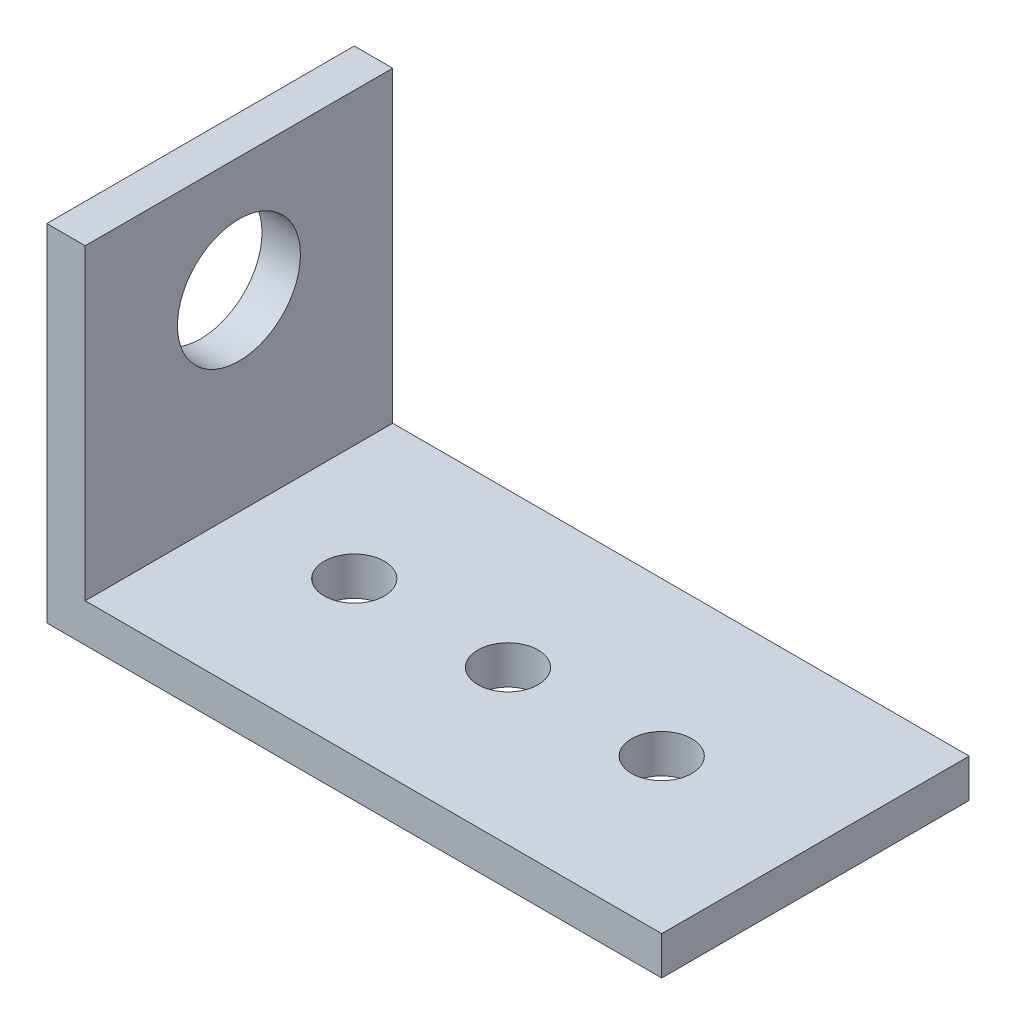
ISO-10303-21;
HEADER;
FILE_DESCRIPTION(('STEP AP214'),'2;1');
FILE_NAME('part.step','',(''),(''),'','','');
FILE_SCHEMA(('AUTOMOTIVE_DESIGN { 1 0 10303 214 1 1 1 1 }'));
ENDSEC;
DATA;
#1=APPLICATION_CONTEXT('core data for automotive mechanical design processes');
#2=APPLICATION_PROTOCOL_DEFINITION('international standard','automotive_design',2000,#1);
#3=PRODUCT_CONTEXT('',#1,'mechanical');
#4=PRODUCT('Part','Part','',(#3));
#5=PRODUCT_RELATED_PRODUCT_CATEGORY('part','',(#4));
#6=PRODUCT_DEFINITION_FORMATION('','',#4);
#7=PRODUCT_DEFINITION_CONTEXT('part definition',#1,'design');
#8=PRODUCT_DEFINITION('design','',#6,#7);
#9=PRODUCT_DEFINITION_SHAPE('','',#8);
#10=(LENGTH_UNIT() NAMED_UNIT(*) SI_UNIT(.MILLI.,.METRE.));
#11=(NAMED_UNIT(*) PLANE_ANGLE_UNIT() SI_UNIT($,.RADIAN.));
#12=(NAMED_UNIT(*) SI_UNIT($,.STERADIAN.) SOLID_ANGLE_UNIT());
#13=UNCERTAINTY_MEASURE_WITH_UNIT(LENGTH_MEASURE(1.E-05),#10,'distance_accuracy_value','');
#14=(GEOMETRIC_REPRESENTATION_CONTEXT(3) GLOBAL_UNCERTAINTY_ASSIGNED_CONTEXT((#13)) GLOBAL_UNIT_ASSIGNED_CONTEXT((#10,
#11,#12)) REPRESENTATION_CONTEXT('',''));
#15=CARTESIAN_POINT('',(0.,0.,0.));
#16=DIRECTION('',(0.,0.,1.));
#17=DIRECTION('',(1.,0.,0.));
#18=AXIS2_PLACEMENT_3D('',#15,#16,#17);
#19=CARTESIAN_POINT('',(0.,0.,25.4));
#20=DIRECTION('',(-1.,0.,0.));
#21=DIRECTION('',(0.,0.,1.));
#22=AXIS2_PLACEMENT_3D('',#19,#20,#21);
#23=PLANE('',#22);
#24=CARTESIAN_POINT('',(0.,19.05,12.7));
#25=DIRECTION('',(-1.,0.,0.));
#26=DIRECTION('',(0.,0.,1.));
#27=AXIS2_PLACEMENT_3D('',#24,#25,#26);
#28=CIRCLE('',#27,5.08);
#29=CARTESIAN_POINT('',(0.,19.05,17.78));
#30=VERTEX_POINT('',#29);
#31=EDGE_CURVE('E212',#30,#30,#28,.T.);
#32=ORIENTED_EDGE('',*,*,#31,.F.);
#33=EDGE_LOOP('',(#32));
#34=FACE_BOUND('',#33,.T.);
#35=DIRECTION('',(0.,1.,0.));
#36=VECTOR('',#35,1.);
#37=CARTESIAN_POINT('',(0.,0.,0.));
#38=LINE('',#37,#36);
#39=CARTESIAN_POINT('',(0.,0.,0.));
#40=VERTEX_POINT('',#39);
#41=CARTESIAN_POINT('',(0.,28.575,0.));
#42=VERTEX_POINT('',#41);
#43=EDGE_CURVE('E152',#40,#42,#38,.T.);
#44=ORIENTED_EDGE('',*,*,#43,.F.);
#45=DIRECTION('',(0.,0.,-1.));
#46=VECTOR('',#45,1.);
#47=CARTESIAN_POINT('',(0.,0.,25.4));
#48=LINE('',#47,#46);
#49=CARTESIAN_POINT('',(0.,0.,25.4));
#50=VERTEX_POINT('',#49);
#51=EDGE_CURVE('E13',#50,#40,#48,.T.);
#52=ORIENTED_EDGE('',*,*,#51,.F.);
#53=DIRECTION('',(0.,1.,0.));
#54=VECTOR('',#53,1.);
#55=CARTESIAN_POINT('',(0.,0.,25.4));
#56=LINE('',#55,#54);
#57=CARTESIAN_POINT('',(0.,28.575,25.4));
#58=VERTEX_POINT('',#57);
#59=EDGE_CURVE('E172',#50,#58,#56,.T.);
#60=ORIENTED_EDGE('',*,*,#59,.T.);
#61=DIRECTION('',(0.,0.,-1.));
#62=VECTOR('',#61,1.);
#63=CARTESIAN_POINT('',(0.,28.575,25.4));
#64=LINE('',#63,#62);
#65=EDGE_CURVE('E78',#58,#42,#64,.T.);
#66=ORIENTED_EDGE('',*,*,#65,.T.);
#67=EDGE_LOOP('',(#44,#52,#60,#66));
#68=FACE_BOUND('',#67,.T.);
#69=ADVANCED_FACE('F61',(#34,#68),#23,.T.);
#70=CARTESIAN_POINT('',(0.,0.,25.4));
#71=DIRECTION('',(0.,1.,0.));
#72=DIRECTION('',(0.,0.,1.));
#73=AXIS2_PLACEMENT_3D('',#70,#71,#72);
#74=PLANE('',#73);
#75=CARTESIAN_POINT('',(38.1,0.,12.7));
#76=DIRECTION('',(0.,1.,0.));
#77=DIRECTION('',(0.,0.,1.));
#78=AXIS2_PLACEMENT_3D('',#75,#76,#77);
#79=CIRCLE('',#78,2.4892);
#80=CARTESIAN_POINT('',(38.1,0.,15.1892));
#81=VERTEX_POINT('',#80);
#82=EDGE_CURVE('E156',#81,#81,#79,.T.);
#83=ORIENTED_EDGE('',*,*,#82,.T.);
#84=EDGE_LOOP('',(#83));
#85=FACE_BOUND('',#84,.T.);
#86=CARTESIAN_POINT('',(25.4,0.,12.7));
#87=DIRECTION('',(0.,1.,0.));
#88=DIRECTION('',(0.,0.,1.));
#89=AXIS2_PLACEMENT_3D('',#86,#87,#88);
#90=CIRCLE('',#89,2.4892);
#91=CARTESIAN_POINT('',(25.4,0.,15.1892));
#92=VERTEX_POINT('',#91);
#93=EDGE_CURVE('E239',#92,#92,#90,.T.);
#94=ORIENTED_EDGE('',*,*,#93,.T.);
#95=EDGE_LOOP('',(#94));
#96=FACE_BOUND('',#95,.T.);
#97=CARTESIAN_POINT('',(12.7,0.,12.7));
#98=DIRECTION('',(0.,1.,0.));
#99=DIRECTION('',(0.,0.,1.));
#100=AXIS2_PLACEMENT_3D('',#97,#98,#99);
#101=CIRCLE('',#100,2.4892);
#102=CARTESIAN_POINT('',(12.7,0.,15.1892));
#103=VERTEX_POINT('',#102);
#104=EDGE_CURVE('E232',#103,#103,#101,.T.);
#105=ORIENTED_EDGE('',*,*,#104,.T.);
#106=EDGE_LOOP('',(#105));
#107=FACE_BOUND('',#106,.T.);
#108=DIRECTION('',(1.,0.,0.));
#109=VECTOR('',#108,1.);
#110=CARTESIAN_POINT('',(0.,0.,0.));
#111=LINE('',#110,#109);
#112=CARTESIAN_POINT('',(50.8,0.,0.));
#113=VERTEX_POINT('',#112);
#114=EDGE_CURVE('E155',#40,#113,#111,.T.);
#115=ORIENTED_EDGE('',*,*,#114,.T.);
#116=DIRECTION('',(0.,0.,-1.));
#117=VECTOR('',#116,1.);
#118=CARTESIAN_POINT('',(50.8,0.,25.4));
#119=LINE('',#118,#117);
#120=CARTESIAN_POINT('',(50.8,0.,25.4));
#121=VERTEX_POINT('',#120);
#122=EDGE_CURVE('E70',#121,#113,#119,.T.);
#123=ORIENTED_EDGE('',*,*,#122,.F.);
#124=DIRECTION('',(1.,0.,0.));
#125=VECTOR('',#124,1.);
#126=CARTESIAN_POINT('',(0.,0.,25.4));
#127=LINE('',#126,#125);
#128=EDGE_CURVE('E146',#50,#121,#127,.T.);
#129=ORIENTED_EDGE('',*,*,#128,.F.);
#130=ORIENTED_EDGE('',*,*,#51,.T.);
#131=EDGE_LOOP('',(#115,#123,#129,#130));
#132=FACE_BOUND('',#131,.T.);
#133=ADVANCED_FACE('F203',(#85,#96,#107,#132),#74,.F.);
#134=CARTESIAN_POINT('',(50.8,0.,25.4));
#135=DIRECTION('',(-1.,0.,0.));
#136=DIRECTION('',(0.,0.,1.));
#137=AXIS2_PLACEMENT_3D('',#134,#135,#136);
#138=PLANE('',#137);
#139=DIRECTION('',(0.,1.,0.));
#140=VECTOR('',#139,1.);
#141=CARTESIAN_POINT('',(50.8,0.,0.));
#142=LINE('',#141,#140);
#143=CARTESIAN_POINT('',(50.8,3.175,0.));
#144=VERTEX_POINT('',#143);
#145=EDGE_CURVE('E159',#113,#144,#142,.T.);
#146=ORIENTED_EDGE('',*,*,#145,.T.);
#147=DIRECTION('',(0.,0.,-1.));
#148=VECTOR('',#147,1.);
#149=CARTESIAN_POINT('',(50.8,3.175,25.4));
#150=LINE('',#149,#148);
#151=CARTESIAN_POINT('',(50.8,3.175,25.4));
#152=VERTEX_POINT('',#151);
#153=EDGE_CURVE('E127',#152,#144,#150,.T.);
#154=ORIENTED_EDGE('',*,*,#153,.F.);
#155=DIRECTION('',(0.,1.,0.));
#156=VECTOR('',#155,1.);
#157=CARTESIAN_POINT('',(50.8,0.,25.4));
#158=LINE('',#157,#156);
#159=EDGE_CURVE('E139',#121,#152,#158,.T.);
#160=ORIENTED_EDGE('',*,*,#159,.F.);
#161=ORIENTED_EDGE('',*,*,#122,.T.);
#162=EDGE_LOOP('',(#146,#154,#160,#161));
#163=FACE_BOUND('',#162,.T.);
#164=ADVANCED_FACE('F185',(#163),#138,.F.);
#165=CARTESIAN_POINT('',(0.,3.175,25.4));
#166=DIRECTION('',(0.,1.,0.));
#167=DIRECTION('',(0.,0.,1.));
#168=AXIS2_PLACEMENT_3D('',#165,#166,#167);
#169=PLANE('',#168);
#170=CARTESIAN_POINT('',(38.1,3.175,12.7));
#171=DIRECTION('',(0.,1.,0.));
#172=DIRECTION('',(0.,0.,1.));
#173=AXIS2_PLACEMENT_3D('',#170,#171,#172);
#174=CIRCLE('',#173,2.4892);
#175=CARTESIAN_POINT('',(38.1,3.175,15.1892));
#176=VERTEX_POINT('',#175);
#177=EDGE_CURVE('E228',#176,#176,#174,.T.);
#178=ORIENTED_EDGE('',*,*,#177,.F.);
#179=EDGE_LOOP('',(#178));
#180=FACE_BOUND('',#179,.T.);
#181=CARTESIAN_POINT('',(25.4,3.175,12.7));
#182=DIRECTION('',(0.,1.,0.));
#183=DIRECTION('',(0.,0.,1.));
#184=AXIS2_PLACEMENT_3D('',#181,#182,#183);
#185=CIRCLE('',#184,2.4892);
#186=CARTESIAN_POINT('',(25.4,3.175,15.1892));
#187=VERTEX_POINT('',#186);
#188=EDGE_CURVE('E223',#187,#187,#185,.T.);
#189=ORIENTED_EDGE('',*,*,#188,.F.);
#190=EDGE_LOOP('',(#189));
#191=FACE_BOUND('',#190,.T.);
#192=CARTESIAN_POINT('',(12.7,3.175,12.7));
#193=DIRECTION('',(0.,1.,0.));
#194=DIRECTION('',(0.,0.,1.));
#195=AXIS2_PLACEMENT_3D('',#192,#193,#194);
#196=CIRCLE('',#195,2.4892);
#197=CARTESIAN_POINT('',(12.7,3.175,15.1892));
#198=VERTEX_POINT('',#197);
#199=EDGE_CURVE('E215',#198,#198,#196,.T.);
#200=ORIENTED_EDGE('',*,*,#199,.F.);
#201=EDGE_LOOP('',(#200));
#202=FACE_BOUND('',#201,.T.);
#203=DIRECTION('',(1.,0.,0.));
#204=VECTOR('',#203,1.);
#205=CARTESIAN_POINT('',(0.,3.175,0.));
#206=LINE('',#205,#204);
#207=CARTESIAN_POINT('',(3.175,3.175,0.));
#208=VERTEX_POINT('',#207);
#209=EDGE_CURVE('E123',#208,#144,#206,.T.);
#210=ORIENTED_EDGE('',*,*,#209,.F.);
#211=DIRECTION('',(0.,0.,-1.));
#212=VECTOR('',#211,1.);
#213=CARTESIAN_POINT('',(3.175,3.175,25.4));
#214=LINE('',#213,#212);
#215=CARTESIAN_POINT('',(3.175,3.175,25.4));
#216=VERTEX_POINT('',#215);
#217=EDGE_CURVE('E117',#216,#208,#214,.T.);
#218=ORIENTED_EDGE('',*,*,#217,.F.);
#219=DIRECTION('',(1.,0.,0.));
#220=VECTOR('',#219,1.);
#221=CARTESIAN_POINT('',(0.,3.175,25.4));
#222=LINE('',#221,#220);
#223=EDGE_CURVE('E121',#216,#152,#222,.T.);
#224=ORIENTED_EDGE('',*,*,#223,.T.);
#225=ORIENTED_EDGE('',*,*,#153,.T.);
#226=EDGE_LOOP('',(#210,#218,#224,#225));
#227=FACE_BOUND('',#226,.T.);
#228=ADVANCED_FACE('F119',(#180,#191,#202,#227),#169,.T.);
#229=CARTESIAN_POINT('',(3.175,0.,25.4));
#230=DIRECTION('',(-1.,0.,0.));
#231=DIRECTION('',(0.,0.,1.));
#232=AXIS2_PLACEMENT_3D('',#229,#230,#231);
#233=PLANE('',#232);
#234=CARTESIAN_POINT('',(3.175,19.05,12.7));
#235=DIRECTION('',(1.,0.,0.));
#236=DIRECTION('',(0.,0.,-1.));
#237=AXIS2_PLACEMENT_3D('',#234,#235,#236);
#238=CIRCLE('',#237,5.08);
#239=CARTESIAN_POINT('',(3.175,19.05,7.62));
#240=VERTEX_POINT('',#239);
#241=EDGE_CURVE('E216',#240,#240,#238,.T.);
#242=ORIENTED_EDGE('',*,*,#241,.F.);
#243=EDGE_LOOP('',(#242));
#244=FACE_BOUND('',#243,.T.);
#245=DIRECTION('',(0.,1.,0.));
#246=VECTOR('',#245,1.);
#247=CARTESIAN_POINT('',(3.175,0.,0.));
#248=LINE('',#247,#246);
#249=CARTESIAN_POINT('',(3.175,28.575,0.));
#250=VERTEX_POINT('',#249);
#251=EDGE_CURVE('E165',#208,#250,#248,.T.);
#252=ORIENTED_EDGE('',*,*,#251,.T.);
#253=DIRECTION('',(0.,0.,-1.));
#254=VECTOR('',#253,1.);
#255=CARTESIAN_POINT('',(3.175,28.575,25.4));
#256=LINE('',#255,#254);
#257=CARTESIAN_POINT('',(3.175,28.575,25.4));
#258=VERTEX_POINT('',#257);
#259=EDGE_CURVE('E98',#258,#250,#256,.T.);
#260=ORIENTED_EDGE('',*,*,#259,.F.);
#261=DIRECTION('',(0.,1.,0.));
#262=VECTOR('',#261,1.);
#263=CARTESIAN_POINT('',(3.175,0.,25.4));
#264=LINE('',#263,#262);
#265=EDGE_CURVE('E129',#216,#258,#264,.T.);
#266=ORIENTED_EDGE('',*,*,#265,.F.);
#267=ORIENTED_EDGE('',*,*,#217,.T.);
#268=EDGE_LOOP('',(#252,#260,#266,#267));
#269=FACE_BOUND('',#268,.T.);
#270=ADVANCED_FACE('F130',(#244,#269),#233,.F.);
#271=CARTESIAN_POINT('',(0.,28.575,25.4));
#272=DIRECTION('',(0.,1.,0.));
#273=DIRECTION('',(0.,0.,1.));
#274=AXIS2_PLACEMENT_3D('',#271,#272,#273);
#275=PLANE('',#274);
#276=DIRECTION('',(1.,0.,0.));
#277=VECTOR('',#276,1.);
#278=CARTESIAN_POINT('',(0.,28.575,0.));
#279=LINE('',#278,#277);
#280=EDGE_CURVE('E168',#42,#250,#279,.T.);
#281=ORIENTED_EDGE('',*,*,#280,.F.);
#282=ORIENTED_EDGE('',*,*,#65,.F.);
#283=DIRECTION('',(1.,0.,0.));
#284=VECTOR('',#283,1.);
#285=CARTESIAN_POINT('',(0.,28.575,25.4));
#286=LINE('',#285,#284);
#287=EDGE_CURVE('E134',#58,#258,#286,.T.);
#288=ORIENTED_EDGE('',*,*,#287,.T.);
#289=ORIENTED_EDGE('',*,*,#259,.T.);
#290=EDGE_LOOP('',(#281,#282,#288,#289));
#291=FACE_BOUND('',#290,.T.);
#292=ADVANCED_FACE('F190',(#291),#275,.T.);
#293=CARTESIAN_POINT('',(0.,0.,25.4));
#294=DIRECTION('',(0.,0.,1.));
#295=DIRECTION('',(1.,0.,0.));
#296=AXIS2_PLACEMENT_3D('',#293,#294,#295);
#297=PLANE('',#296);
#298=ORIENTED_EDGE('',*,*,#59,.F.);
#299=ORIENTED_EDGE('',*,*,#128,.T.);
#300=ORIENTED_EDGE('',*,*,#159,.T.);
#301=ORIENTED_EDGE('',*,*,#223,.F.);
#302=ORIENTED_EDGE('',*,*,#265,.T.);
#303=ORIENTED_EDGE('',*,*,#287,.F.);
#304=EDGE_LOOP('',(#298,#299,#300,#301,#302,#303));
#305=FACE_BOUND('',#304,.T.);
#306=ADVANCED_FACE('F137',(#305),#297,.T.);
#307=CARTESIAN_POINT('',(0.,0.,0.));
#308=DIRECTION('',(0.,0.,1.));
#309=DIRECTION('',(1.,0.,0.));
#310=AXIS2_PLACEMENT_3D('',#307,#308,#309);
#311=PLANE('',#310);
#312=ORIENTED_EDGE('',*,*,#43,.T.);
#313=ORIENTED_EDGE('',*,*,#280,.T.);
#314=ORIENTED_EDGE('',*,*,#251,.F.);
#315=ORIENTED_EDGE('',*,*,#209,.T.);
#316=ORIENTED_EDGE('',*,*,#145,.F.);
#317=ORIENTED_EDGE('',*,*,#114,.F.);
#318=EDGE_LOOP('',(#312,#313,#314,#315,#316,#317));
#319=FACE_BOUND('',#318,.T.);
#320=ADVANCED_FACE('F189',(#319),#311,.F.);
#321=CARTESIAN_POINT('',(12.7,-22.225,12.7));
#322=DIRECTION('',(0.,1.,0.));
#323=DIRECTION('',(0.,0.,1.));
#324=AXIS2_PLACEMENT_3D('',#321,#322,#323);
#325=CYLINDRICAL_SURFACE('',#324,2.4892);
#326=ORIENTED_EDGE('',*,*,#199,.T.);
#327=EDGE_LOOP('',(#326));
#328=FACE_BOUND('',#327,.T.);
#329=ORIENTED_EDGE('',*,*,#104,.F.);
#330=EDGE_LOOP('',(#329));
#331=FACE_BOUND('',#330,.T.);
#332=ADVANCED_FACE('F307',(#328,#331),#325,.F.);
#333=CARTESIAN_POINT('',(25.4,-22.225,12.7));
#334=DIRECTION('',(0.,1.,0.));
#335=DIRECTION('',(0.,0.,1.));
#336=AXIS2_PLACEMENT_3D('',#333,#334,#335);
#337=CYLINDRICAL_SURFACE('',#336,2.4892);
#338=ORIENTED_EDGE('',*,*,#188,.T.);
#339=EDGE_LOOP('',(#338));
#340=FACE_BOUND('',#339,.T.);
#341=ORIENTED_EDGE('',*,*,#93,.F.);
#342=EDGE_LOOP('',(#341));
#343=FACE_BOUND('',#342,.T.);
#344=ADVANCED_FACE('F299',(#340,#343),#337,.F.);
#345=CARTESIAN_POINT('',(38.1,-22.225,12.7));
#346=DIRECTION('',(0.,1.,0.));
#347=DIRECTION('',(0.,0.,1.));
#348=AXIS2_PLACEMENT_3D('',#345,#346,#347);
#349=CYLINDRICAL_SURFACE('',#348,2.4892);
#350=ORIENTED_EDGE('',*,*,#177,.T.);
#351=EDGE_LOOP('',(#350));
#352=FACE_BOUND('',#351,.T.);
#353=ORIENTED_EDGE('',*,*,#82,.F.);
#354=EDGE_LOOP('',(#353));
#355=FACE_BOUND('',#354,.T.);
#356=ADVANCED_FACE('F297',(#352,#355),#349,.F.);
#357=CARTESIAN_POINT('',(-22.225,19.05,12.7));
#358=DIRECTION('',(1.,0.,0.));
#359=DIRECTION('',(0.,0.,-1.));
#360=AXIS2_PLACEMENT_3D('',#357,#358,#359);
#361=CYLINDRICAL_SURFACE('',#360,5.08);
#362=ORIENTED_EDGE('',*,*,#31,.T.);
#363=EDGE_LOOP('',(#362));
#364=FACE_BOUND('',#363,.T.);
#365=ORIENTED_EDGE('',*,*,#241,.T.);
#366=EDGE_LOOP('',(#365));
#367=FACE_BOUND('',#366,.T.);
#368=ADVANCED_FACE('F298',(#364,#367),#361,.F.);
#369=CLOSED_SHELL('',(#69,#133,#164,#228,#270,#292,#306,#320,#332,#344,#356,#368));
#370=MANIFOLD_SOLID_BREP('B2',#369);
#371=ADVANCED_BREP_SHAPE_REPRESENTATION('',(#18,#370),#14);
#372=SHAPE_DEFINITION_REPRESENTATION(#9,#371);
ENDSEC;
END-ISO-10303-21;
